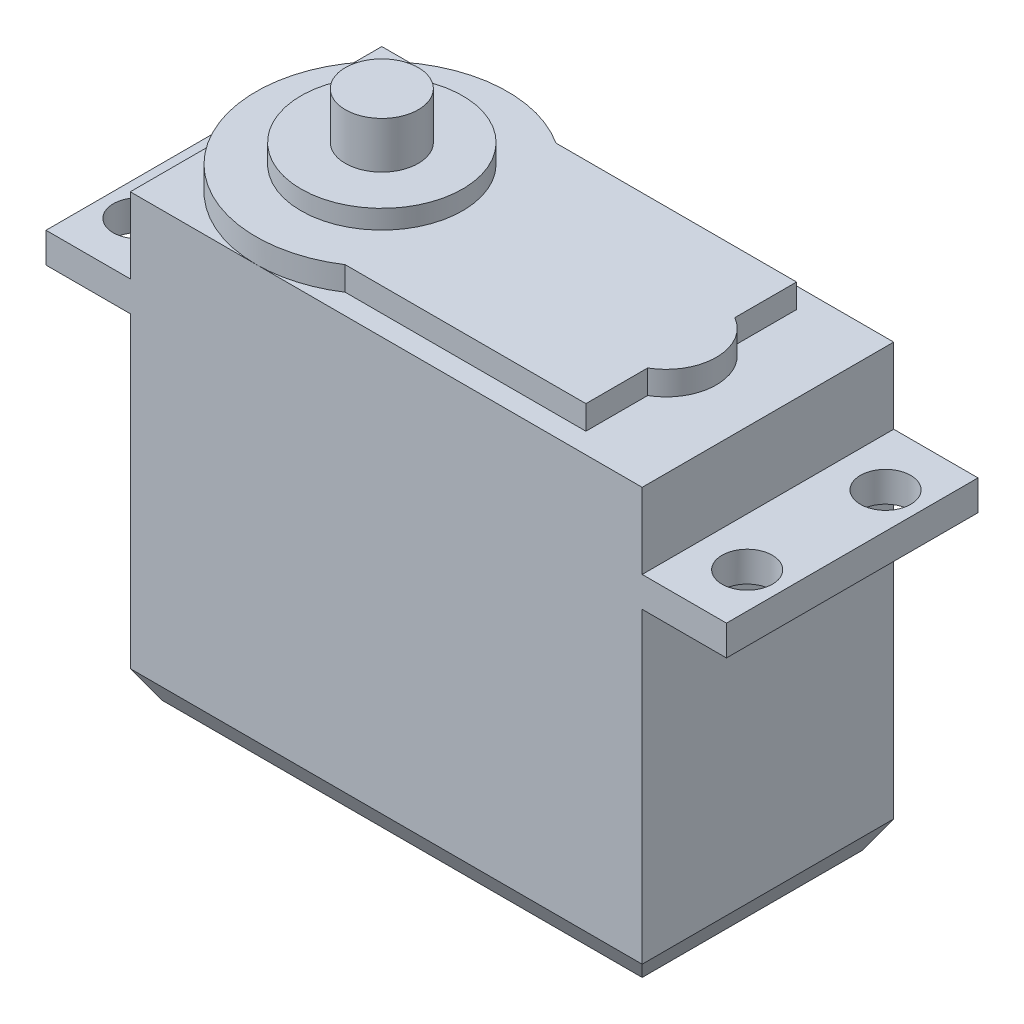
ISO-10303-21;
HEADER;
FILE_DESCRIPTION(('STEP AP214'),'2;1');
FILE_NAME('part.step','',(''),(''),'','','');
FILE_SCHEMA(('AUTOMOTIVE_DESIGN { 1 0 10303 214 1 1 1 1 }'));
ENDSEC;
DATA;
#1=APPLICATION_CONTEXT('core data for automotive mechanical design processes');
#2=APPLICATION_PROTOCOL_DEFINITION('international standard','automotive_design',2000,#1);
#3=PRODUCT_CONTEXT('',#1,'mechanical');
#4=PRODUCT('Part','Part','',(#3));
#5=PRODUCT_RELATED_PRODUCT_CATEGORY('part','',(#4));
#6=PRODUCT_DEFINITION_FORMATION('','',#4);
#7=PRODUCT_DEFINITION_CONTEXT('part definition',#1,'design');
#8=PRODUCT_DEFINITION('design','',#6,#7);
#9=PRODUCT_DEFINITION_SHAPE('','',#8);
#10=(LENGTH_UNIT() NAMED_UNIT(*) SI_UNIT(.MILLI.,.METRE.));
#11=(NAMED_UNIT(*) PLANE_ANGLE_UNIT() SI_UNIT($,.RADIAN.));
#12=(NAMED_UNIT(*) SI_UNIT($,.STERADIAN.) SOLID_ANGLE_UNIT());
#13=UNCERTAINTY_MEASURE_WITH_UNIT(LENGTH_MEASURE(1.E-05),#10,'distance_accuracy_value','');
#14=(GEOMETRIC_REPRESENTATION_CONTEXT(3) GLOBAL_UNCERTAINTY_ASSIGNED_CONTEXT((#13)) GLOBAL_UNIT_ASSIGNED_CONTEXT((#10,
#11,#12)) REPRESENTATION_CONTEXT('',''));
#15=CARTESIAN_POINT('',(0.,0.,0.));
#16=DIRECTION('',(0.,0.,1.));
#17=DIRECTION('',(1.,0.,0.));
#18=AXIS2_PLACEMENT_3D('',#15,#16,#17);
#19=CARTESIAN_POINT('',(-10.35,20.9,0.));
#20=DIRECTION('',(0.,1.,0.));
#21=DIRECTION('',(0.,0.,1.));
#22=AXIS2_PLACEMENT_3D('',#19,#20,#21);
#23=PLANE('',#22);
#24=CARTESIAN_POINT('',(-10.35,20.9,0.));
#25=DIRECTION('',(0.,1.,0.));
#26=DIRECTION('',(0.,0.,1.));
#27=AXIS2_PLACEMENT_3D('',#24,#25,#26);
#28=CIRCLE('',#27,6.425);
#29=CARTESIAN_POINT('',(-10.35,20.9,6.425));
#30=VERTEX_POINT('',#29);
#31=EDGE_CURVE('E335',#30,#30,#28,.T.);
#32=ORIENTED_EDGE('',*,*,#31,.T.);
#33=EDGE_LOOP('',(#32));
#34=FACE_BOUND('',#33,.T.);
#35=CARTESIAN_POINT('',(-10.35,20.9,0.));
#36=DIRECTION('',(0.,1.,0.));
#37=DIRECTION('',(0.,0.,1.));
#38=AXIS2_PLACEMENT_3D('',#35,#36,#37);
#39=CIRCLE('',#38,2.9);
#40=CARTESIAN_POINT('',(-10.35,20.9,2.9));
#41=VERTEX_POINT('',#40);
#42=EDGE_CURVE('E658',#41,#41,#39,.T.);
#43=ORIENTED_EDGE('',*,*,#42,.F.);
#44=EDGE_LOOP('',(#43));
#45=FACE_BOUND('',#44,.T.);
#46=ADVANCED_FACE('F33',(#34,#45),#23,.T.);
#47=CARTESIAN_POINT('',(-27.05,9.1,-10.));
#48=DIRECTION('',(0.,1.,0.));
#49=DIRECTION('',(0.,0.,1.));
#50=AXIS2_PLACEMENT_3D('',#47,#48,#49);
#51=PLANE('',#50);
#52=DIRECTION('',(0.,0.,1.));
#53=VECTOR('',#52,1.);
#54=CARTESIAN_POINT('',(-20.35,9.1,-10.));
#55=LINE('',#54,#53);
#56=CARTESIAN_POINT('',(-20.35,9.1,-10.));
#57=VERTEX_POINT('',#56);
#58=CARTESIAN_POINT('',(-20.35,9.1,10.));
#59=VERTEX_POINT('',#58);
#60=EDGE_CURVE('E241',#57,#59,#55,.T.);
#61=ORIENTED_EDGE('',*,*,#60,.T.);
#62=DIRECTION('',(1.,0.,0.));
#63=VECTOR('',#62,1.);
#64=CARTESIAN_POINT('',(-27.05,9.1,10.));
#65=LINE('',#64,#63);
#66=CARTESIAN_POINT('',(-27.05,9.1,10.));
#67=VERTEX_POINT('',#66);
#68=EDGE_CURVE('E294',#67,#59,#65,.T.);
#69=ORIENTED_EDGE('',*,*,#68,.F.);
#70=DIRECTION('',(0.,0.,1.));
#71=VECTOR('',#70,1.);
#72=CARTESIAN_POINT('',(-27.05,9.1,-10.));
#73=LINE('',#72,#71);
#74=CARTESIAN_POINT('',(-27.05,9.1,-10.));
#75=VERTEX_POINT('',#74);
#76=EDGE_CURVE('E427',#75,#67,#73,.T.);
#77=ORIENTED_EDGE('',*,*,#76,.F.);
#78=DIRECTION('',(1.,0.,0.));
#79=VECTOR('',#78,1.);
#80=CARTESIAN_POINT('',(-27.05,9.1,-10.));
#81=LINE('',#80,#79);
#82=EDGE_CURVE('E288',#75,#57,#81,.T.);
#83=ORIENTED_EDGE('',*,*,#82,.T.);
#84=EDGE_LOOP('',(#61,#69,#77,#83));
#85=FACE_BOUND('',#84,.T.);
#86=CARTESIAN_POINT('',(-24.2,9.1,5.5));
#87=DIRECTION('',(0.,1.,0.));
#88=DIRECTION('',(0.,0.,1.));
#89=AXIS2_PLACEMENT_3D('',#86,#87,#88);
#90=CIRCLE('',#89,2.);
#91=CARTESIAN_POINT('',(-24.2,9.1,7.5));
#92=VERTEX_POINT('',#91);
#93=EDGE_CURVE('E338',#92,#92,#90,.T.);
#94=ORIENTED_EDGE('',*,*,#93,.T.);
#95=EDGE_LOOP('',(#94));
#96=FACE_BOUND('',#95,.T.);
#97=CARTESIAN_POINT('',(-24.2,9.1,-5.5));
#98=DIRECTION('',(0.,1.,0.));
#99=DIRECTION('',(0.,0.,1.));
#100=AXIS2_PLACEMENT_3D('',#97,#98,#99);
#101=CIRCLE('',#100,2.);
#102=CARTESIAN_POINT('',(-24.2,9.1,-3.5));
#103=VERTEX_POINT('',#102);
#104=EDGE_CURVE('E661',#103,#103,#101,.F.);
#105=ORIENTED_EDGE('',*,*,#104,.F.);
#106=EDGE_LOOP('',(#105));
#107=FACE_BOUND('',#106,.T.);
#108=ADVANCED_FACE('F424',(#85,#96,#107),#51,.F.);
#109=CARTESIAN_POINT('',(-27.05,11.5,-10.));
#110=DIRECTION('',(0.,-1.,0.));
#111=DIRECTION('',(0.,0.,-1.));
#112=AXIS2_PLACEMENT_3D('',#109,#110,#111);
#113=PLANE('',#112);
#114=DIRECTION('',(0.,0.,-1.));
#115=VECTOR('',#114,1.);
#116=CARTESIAN_POINT('',(-20.35,11.5,-10.));
#117=LINE('',#116,#115);
#118=CARTESIAN_POINT('',(-20.35,11.5,10.));
#119=VERTEX_POINT('',#118);
#120=CARTESIAN_POINT('',(-20.35,11.5,-10.));
#121=VERTEX_POINT('',#120);
#122=EDGE_CURVE('E301',#119,#121,#117,.T.);
#123=ORIENTED_EDGE('',*,*,#122,.T.);
#124=DIRECTION('',(1.,0.,0.));
#125=VECTOR('',#124,1.);
#126=CARTESIAN_POINT('',(-27.05,11.5,-10.));
#127=LINE('',#126,#125);
#128=CARTESIAN_POINT('',(-27.05,11.5,-10.));
#129=VERTEX_POINT('',#128);
#130=EDGE_CURVE('E295',#129,#121,#127,.T.);
#131=ORIENTED_EDGE('',*,*,#130,.F.);
#132=DIRECTION('',(0.,0.,-1.));
#133=VECTOR('',#132,1.);
#134=CARTESIAN_POINT('',(-27.05,11.5,-10.));
#135=LINE('',#134,#133);
#136=CARTESIAN_POINT('',(-27.05,11.5,10.));
#137=VERTEX_POINT('',#136);
#138=EDGE_CURVE('E300',#137,#129,#135,.T.);
#139=ORIENTED_EDGE('',*,*,#138,.F.);
#140=DIRECTION('',(1.,0.,0.));
#141=VECTOR('',#140,1.);
#142=CARTESIAN_POINT('',(-27.05,11.5,10.));
#143=LINE('',#142,#141);
#144=EDGE_CURVE('E291',#137,#119,#143,.T.);
#145=ORIENTED_EDGE('',*,*,#144,.T.);
#146=EDGE_LOOP('',(#123,#131,#139,#145));
#147=FACE_BOUND('',#146,.T.);
#148=CARTESIAN_POINT('',(-24.2,11.5,5.5));
#149=DIRECTION('',(0.,1.,0.));
#150=DIRECTION('',(0.,0.,1.));
#151=AXIS2_PLACEMENT_3D('',#148,#149,#150);
#152=CIRCLE('',#151,2.);
#153=CARTESIAN_POINT('',(-24.2,11.5,7.5));
#154=VERTEX_POINT('',#153);
#155=EDGE_CURVE('E343',#154,#154,#152,.T.);
#156=ORIENTED_EDGE('',*,*,#155,.F.);
#157=EDGE_LOOP('',(#156));
#158=FACE_BOUND('',#157,.T.);
#159=CARTESIAN_POINT('',(-24.2,11.5,-5.5));
#160=DIRECTION('',(0.,-1.,0.));
#161=DIRECTION('',(0.,0.,-1.));
#162=AXIS2_PLACEMENT_3D('',#159,#160,#161);
#163=CIRCLE('',#162,2.);
#164=CARTESIAN_POINT('',(-24.2,11.5,-7.5));
#165=VERTEX_POINT('',#164);
#166=EDGE_CURVE('E657',#165,#165,#163,.T.);
#167=ORIENTED_EDGE('',*,*,#166,.T.);
#168=EDGE_LOOP('',(#167));
#169=FACE_BOUND('',#168,.T.);
#170=ADVANCED_FACE('F481',(#147,#158,#169),#113,.F.);
#171=CARTESIAN_POINT('',(27.05,11.5,-10.));
#172=DIRECTION('',(0.,1.,0.));
#173=DIRECTION('',(0.,0.,1.));
#174=AXIS2_PLACEMENT_3D('',#171,#172,#173);
#175=PLANE('',#174);
#176=DIRECTION('',(0.,0.,-1.));
#177=VECTOR('',#176,1.);
#178=CARTESIAN_POINT('',(20.35,11.5,-10.));
#179=LINE('',#178,#177);
#180=CARTESIAN_POINT('',(20.35,11.5,10.));
#181=VERTEX_POINT('',#180);
#182=CARTESIAN_POINT('',(20.35,11.5,-10.));
#183=VERTEX_POINT('',#182);
#184=EDGE_CURVE('E231',#181,#183,#179,.T.);
#185=ORIENTED_EDGE('',*,*,#184,.F.);
#186=DIRECTION('',(-1.,0.,0.));
#187=VECTOR('',#186,1.);
#188=CARTESIAN_POINT('',(27.05,11.5,10.));
#189=LINE('',#188,#187);
#190=CARTESIAN_POINT('',(27.05,11.5,10.));
#191=VERTEX_POINT('',#190);
#192=EDGE_CURVE('E242',#191,#181,#189,.T.);
#193=ORIENTED_EDGE('',*,*,#192,.F.);
#194=DIRECTION('',(0.,0.,-1.));
#195=VECTOR('',#194,1.);
#196=CARTESIAN_POINT('',(27.05,11.5,-10.));
#197=LINE('',#196,#195);
#198=CARTESIAN_POINT('',(27.05,11.5,-10.));
#199=VERTEX_POINT('',#198);
#200=EDGE_CURVE('E215',#191,#199,#197,.T.);
#201=ORIENTED_EDGE('',*,*,#200,.T.);
#202=DIRECTION('',(-1.,0.,0.));
#203=VECTOR('',#202,1.);
#204=CARTESIAN_POINT('',(27.05,11.5,-10.));
#205=LINE('',#204,#203);
#206=EDGE_CURVE('E239',#199,#183,#205,.T.);
#207=ORIENTED_EDGE('',*,*,#206,.T.);
#208=EDGE_LOOP('',(#185,#193,#201,#207));
#209=FACE_BOUND('',#208,.T.);
#210=CARTESIAN_POINT('',(24.2,11.5,5.5));
#211=DIRECTION('',(0.,1.,0.));
#212=DIRECTION('',(0.,0.,1.));
#213=AXIS2_PLACEMENT_3D('',#210,#211,#212);
#214=CIRCLE('',#213,2.);
#215=CARTESIAN_POINT('',(24.2,11.5,7.5));
#216=VERTEX_POINT('',#215);
#217=EDGE_CURVE('E331',#216,#216,#214,.T.);
#218=ORIENTED_EDGE('',*,*,#217,.F.);
#219=EDGE_LOOP('',(#218));
#220=FACE_BOUND('',#219,.T.);
#221=CARTESIAN_POINT('',(24.2,11.5,-5.5));
#222=DIRECTION('',(0.,-1.,0.));
#223=DIRECTION('',(0.,0.,-1.));
#224=AXIS2_PLACEMENT_3D('',#221,#222,#223);
#225=CIRCLE('',#224,2.);
#226=CARTESIAN_POINT('',(24.2,11.5,-7.5));
#227=VERTEX_POINT('',#226);
#228=EDGE_CURVE('E668',#227,#227,#225,.T.);
#229=ORIENTED_EDGE('',*,*,#228,.T.);
#230=EDGE_LOOP('',(#229));
#231=FACE_BOUND('',#230,.T.);
#232=ADVANCED_FACE('F513',(#209,#220,#231),#175,.T.);
#233=CARTESIAN_POINT('',(27.05,9.1,-10.));
#234=DIRECTION('',(0.,-1.,0.));
#235=DIRECTION('',(0.,0.,-1.));
#236=AXIS2_PLACEMENT_3D('',#233,#234,#235);
#237=PLANE('',#236);
#238=DIRECTION('',(0.,0.,1.));
#239=VECTOR('',#238,1.);
#240=CARTESIAN_POINT('',(20.35,9.1,-10.));
#241=LINE('',#240,#239);
#242=CARTESIAN_POINT('',(20.35,9.1,-10.));
#243=VERTEX_POINT('',#242);
#244=CARTESIAN_POINT('',(20.35,9.1,10.));
#245=VERTEX_POINT('',#244);
#246=EDGE_CURVE('E216',#243,#245,#241,.T.);
#247=ORIENTED_EDGE('',*,*,#246,.F.);
#248=DIRECTION('',(-1.,0.,0.));
#249=VECTOR('',#248,1.);
#250=CARTESIAN_POINT('',(27.05,9.1,-10.));
#251=LINE('',#250,#249);
#252=CARTESIAN_POINT('',(27.05,9.1,-10.));
#253=VERTEX_POINT('',#252);
#254=EDGE_CURVE('E225',#253,#243,#251,.T.);
#255=ORIENTED_EDGE('',*,*,#254,.F.);
#256=DIRECTION('',(0.,0.,1.));
#257=VECTOR('',#256,1.);
#258=CARTESIAN_POINT('',(27.05,9.1,-10.));
#259=LINE('',#258,#257);
#260=CARTESIAN_POINT('',(27.05,9.1,10.));
#261=VERTEX_POINT('',#260);
#262=EDGE_CURVE('E222',#253,#261,#259,.T.);
#263=ORIENTED_EDGE('',*,*,#262,.T.);
#264=DIRECTION('',(-1.,0.,0.));
#265=VECTOR('',#264,1.);
#266=CARTESIAN_POINT('',(27.05,9.1,10.));
#267=LINE('',#266,#265);
#268=EDGE_CURVE('E246',#261,#245,#267,.T.);
#269=ORIENTED_EDGE('',*,*,#268,.T.);
#270=EDGE_LOOP('',(#247,#255,#263,#269));
#271=FACE_BOUND('',#270,.T.);
#272=CARTESIAN_POINT('',(24.2,9.1,5.5));
#273=DIRECTION('',(0.,-1.,0.));
#274=DIRECTION('',(0.,0.,-1.));
#275=AXIS2_PLACEMENT_3D('',#272,#273,#274);
#276=CIRCLE('',#275,2.);
#277=CARTESIAN_POINT('',(24.2,9.1,3.5));
#278=VERTEX_POINT('',#277);
#279=EDGE_CURVE('E328',#278,#278,#276,.T.);
#280=ORIENTED_EDGE('',*,*,#279,.F.);
#281=EDGE_LOOP('',(#280));
#282=FACE_BOUND('',#281,.T.);
#283=CARTESIAN_POINT('',(24.2,9.1,-5.5));
#284=DIRECTION('',(0.,-1.,0.));
#285=DIRECTION('',(0.,0.,-1.));
#286=AXIS2_PLACEMENT_3D('',#283,#284,#285);
#287=CIRCLE('',#286,2.);
#288=CARTESIAN_POINT('',(24.2,9.1,-7.5));
#289=VERTEX_POINT('',#288);
#290=EDGE_CURVE('E37',#289,#289,#287,.F.);
#291=ORIENTED_EDGE('',*,*,#290,.T.);
#292=EDGE_LOOP('',(#291));
#293=FACE_BOUND('',#292,.T.);
#294=ADVANCED_FACE('F495',(#271,#282,#293),#237,.T.);
#295=CARTESIAN_POINT('',(12.25,19.4,0.));
#296=DIRECTION('',(0.,1.,0.));
#297=DIRECTION('',(0.,0.,1.));
#298=AXIS2_PLACEMENT_3D('',#295,#296,#297);
#299=PLANE('',#298);
#300=DIRECTION('',(-1.,0.,0.));
#301=VECTOR('',#300,1.);
#302=CARTESIAN_POINT('',(-4.88562675140141,19.4,-8.375));
#303=LINE('',#302,#301);
#304=CARTESIAN_POINT('',(14.25,19.4,-8.375));
#305=VERTEX_POINT('',#304);
#306=CARTESIAN_POINT('',(-4.88562675140141,19.4,-8.375));
#307=VERTEX_POINT('',#306);
#308=EDGE_CURVE('E192',#305,#307,#303,.T.);
#309=ORIENTED_EDGE('',*,*,#308,.T.);
#310=CARTESIAN_POINT('',(-10.35,19.4,0.));
#311=DIRECTION('',(0.,1.,0.));
#312=DIRECTION('',(0.,0.,1.));
#313=AXIS2_PLACEMENT_3D('',#310,#311,#312);
#314=CIRCLE('',#313,10.);
#315=CARTESIAN_POINT('',(-4.88562675140141,19.4,8.375));
#316=VERTEX_POINT('',#315);
#317=EDGE_CURVE('E180',#307,#316,#314,.T.);
#318=ORIENTED_EDGE('',*,*,#317,.T.);
#319=DIRECTION('',(1.,0.,0.));
#320=VECTOR('',#319,1.);
#321=CARTESIAN_POINT('',(-4.88562675140141,19.4,8.375));
#322=LINE('',#321,#320);
#323=CARTESIAN_POINT('',(14.25,19.4,8.375));
#324=VERTEX_POINT('',#323);
#325=EDGE_CURVE('E191',#316,#324,#322,.T.);
#326=ORIENTED_EDGE('',*,*,#325,.T.);
#327=DIRECTION('',(0.,0.,-1.));
#328=VECTOR('',#327,1.);
#329=CARTESIAN_POINT('',(14.25,19.4,8.375));
#330=LINE('',#329,#328);
#331=CARTESIAN_POINT('',(14.25,19.4,3.46410161513775));
#332=VERTEX_POINT('',#331);
#333=EDGE_CURVE('E350',#324,#332,#330,.T.);
#334=ORIENTED_EDGE('',*,*,#333,.T.);
#335=CARTESIAN_POINT('',(12.25,19.4,0.));
#336=DIRECTION('',(0.,1.,0.));
#337=DIRECTION('',(0.,0.,1.));
#338=AXIS2_PLACEMENT_3D('',#335,#336,#337);
#339=CIRCLE('',#338,4.);
#340=CARTESIAN_POINT('',(14.25,19.4,-3.46410161513775));
#341=VERTEX_POINT('',#340);
#342=EDGE_CURVE('E352',#332,#341,#339,.T.);
#343=ORIENTED_EDGE('',*,*,#342,.T.);
#344=DIRECTION('',(0.,0.,-1.));
#345=VECTOR('',#344,1.);
#346=CARTESIAN_POINT('',(14.25,19.4,-3.46410161513775));
#347=LINE('',#346,#345);
#348=EDGE_CURVE('E198',#341,#305,#347,.T.);
#349=ORIENTED_EDGE('',*,*,#348,.T.);
#350=EDGE_LOOP('',(#309,#318,#326,#334,#343,#349));
#351=FACE_BOUND('',#350,.T.);
#352=CARTESIAN_POINT('',(-10.35,19.4,0.));
#353=DIRECTION('',(0.,1.,0.));
#354=DIRECTION('',(0.,0.,1.));
#355=AXIS2_PLACEMENT_3D('',#352,#353,#354);
#356=CIRCLE('',#355,6.425);
#357=CARTESIAN_POINT('',(-10.35,19.4,6.425));
#358=VERTEX_POINT('',#357);
#359=EDGE_CURVE('E330',#358,#358,#356,.T.);
#360=ORIENTED_EDGE('',*,*,#359,.F.);
#361=EDGE_LOOP('',(#360));
#362=FACE_BOUND('',#361,.T.);
#363=ADVANCED_FACE('F195',(#351,#362),#299,.T.);
#364=CARTESIAN_POINT('',(-20.35,17.5,10.));
#365=DIRECTION('',(0.,-1.,0.));
#366=DIRECTION('',(0.,0.,-1.));
#367=AXIS2_PLACEMENT_3D('',#364,#365,#366);
#368=PLANE('',#367);
#369=DIRECTION('',(-1.,0.,0.));
#370=VECTOR('',#369,1.);
#371=CARTESIAN_POINT('',(-4.88562675140141,17.5,-8.375));
#372=LINE('',#371,#370);
#373=CARTESIAN_POINT('',(14.25,17.5,-8.375));
#374=VERTEX_POINT('',#373);
#375=CARTESIAN_POINT('',(-4.88562675140141,17.5,-8.375));
#376=VERTEX_POINT('',#375);
#377=EDGE_CURVE('E51',#374,#376,#372,.T.);
#378=ORIENTED_EDGE('',*,*,#377,.F.);
#379=DIRECTION('',(0.,0.,-1.));
#380=VECTOR('',#379,1.);
#381=CARTESIAN_POINT('',(14.25,17.5,-3.46410161513775));
#382=LINE('',#381,#380);
#383=CARTESIAN_POINT('',(14.25,17.5,-3.46410161513775));
#384=VERTEX_POINT('',#383);
#385=EDGE_CURVE('E55',#384,#374,#382,.T.);
#386=ORIENTED_EDGE('',*,*,#385,.F.);
#387=CARTESIAN_POINT('',(12.25,17.5,0.));
#388=DIRECTION('',(0.,1.,0.));
#389=DIRECTION('',(0.,0.,1.));
#390=AXIS2_PLACEMENT_3D('',#387,#388,#389);
#391=CIRCLE('',#390,4.);
#392=CARTESIAN_POINT('',(14.25,17.5,3.46410161513775));
#393=VERTEX_POINT('',#392);
#394=EDGE_CURVE('E363',#393,#384,#391,.T.);
#395=ORIENTED_EDGE('',*,*,#394,.F.);
#396=DIRECTION('',(0.,0.,-1.));
#397=VECTOR('',#396,1.);
#398=CARTESIAN_POINT('',(14.25,17.5,8.375));
#399=LINE('',#398,#397);
#400=CARTESIAN_POINT('',(14.25,17.5,8.375));
#401=VERTEX_POINT('',#400);
#402=EDGE_CURVE('E360',#401,#393,#399,.T.);
#403=ORIENTED_EDGE('',*,*,#402,.F.);
#404=DIRECTION('',(1.,0.,0.));
#405=VECTOR('',#404,1.);
#406=CARTESIAN_POINT('',(-4.88562675140141,17.5,8.375));
#407=LINE('',#406,#405);
#408=CARTESIAN_POINT('',(-4.88562675140141,17.5,8.375));
#409=VERTEX_POINT('',#408);
#410=EDGE_CURVE('E357',#409,#401,#407,.T.);
#411=ORIENTED_EDGE('',*,*,#410,.F.);
#412=CARTESIAN_POINT('',(-10.35,17.5,0.));
#413=DIRECTION('',(0.,1.,0.));
#414=DIRECTION('',(0.,0.,1.));
#415=AXIS2_PLACEMENT_3D('',#412,#413,#414);
#416=CIRCLE('',#415,10.);
#417=CARTESIAN_POINT('',(-10.35,17.5,10.));
#418=VERTEX_POINT('',#417);
#419=EDGE_CURVE('E321',#418,#409,#416,.T.);
#420=ORIENTED_EDGE('',*,*,#419,.F.);
#421=DIRECTION('',(-1.,0.,0.));
#422=VECTOR('',#421,1.);
#423=CARTESIAN_POINT('',(-20.35,17.5,10.));
#424=LINE('',#423,#422);
#425=CARTESIAN_POINT('',(20.35,17.5,10.));
#426=VERTEX_POINT('',#425);
#427=EDGE_CURVE('E313',#426,#418,#424,.T.);
#428=ORIENTED_EDGE('',*,*,#427,.F.);
#429=DIRECTION('',(0.,0.,-1.));
#430=VECTOR('',#429,1.);
#431=CARTESIAN_POINT('',(20.35,17.5,10.));
#432=LINE('',#431,#430);
#433=CARTESIAN_POINT('',(20.35,17.5,-10.));
#434=VERTEX_POINT('',#433);
#435=EDGE_CURVE('E262',#426,#434,#432,.T.);
#436=ORIENTED_EDGE('',*,*,#435,.T.);
#437=DIRECTION('',(-1.,0.,0.));
#438=VECTOR('',#437,1.);
#439=CARTESIAN_POINT('',(-20.35,17.5,-10.));
#440=LINE('',#439,#438);
#441=CARTESIAN_POINT('',(-10.35,17.5,-10.));
#442=VERTEX_POINT('',#441);
#443=EDGE_CURVE('E284',#434,#442,#440,.T.);
#444=ORIENTED_EDGE('',*,*,#443,.T.);
#445=EDGE_CURVE('E44',#376,#442,#416,.T.);
#446=ORIENTED_EDGE('',*,*,#445,.F.);
#447=EDGE_LOOP('',(#378,#386,#395,#403,#411,#420,#428,#436,#444,#446));
#448=FACE_BOUND('',#447,.T.);
#449=ADVANCED_FACE('F380',(#448),#368,.F.);
#450=CARTESIAN_POINT('',(-20.35,17.5,0.));
#451=VERTEX_POINT('',#450);
#452=EDGE_CURVE('E11',#442,#451,#416,.T.);
#453=ORIENTED_EDGE('',*,*,#452,.F.);
#454=CARTESIAN_POINT('',(-20.35,17.5,-10.));
#455=VERTEX_POINT('',#454);
#456=EDGE_CURVE('E276',#442,#455,#440,.T.);
#457=ORIENTED_EDGE('',*,*,#456,.T.);
#458=DIRECTION('',(0.,0.,-1.));
#459=VECTOR('',#458,1.);
#460=CARTESIAN_POINT('',(-20.35,17.5,10.));
#461=LINE('',#460,#459);
#462=EDGE_CURVE('E394',#451,#455,#461,.T.);
#463=ORIENTED_EDGE('',*,*,#462,.F.);
#464=EDGE_LOOP('',(#453,#457,#463));
#465=FACE_BOUND('',#464,.T.);
#466=ADVANCED_FACE('F395',(#465),#368,.F.);
#467=EDGE_CURVE('E42',#451,#418,#416,.T.);
#468=ORIENTED_EDGE('',*,*,#467,.F.);
#469=CARTESIAN_POINT('',(-20.35,17.5,10.));
#470=VERTEX_POINT('',#469);
#471=EDGE_CURVE('E389',#470,#451,#461,.T.);
#472=ORIENTED_EDGE('',*,*,#471,.F.);
#473=EDGE_CURVE('E317',#418,#470,#424,.T.);
#474=ORIENTED_EDGE('',*,*,#473,.F.);
#475=EDGE_LOOP('',(#468,#472,#474));
#476=FACE_BOUND('',#475,.T.);
#477=ADVANCED_FACE('F387',(#476),#368,.F.);
#478=CARTESIAN_POINT('',(20.35,-17.5,10.));
#479=DIRECTION('',(-1.,0.,0.));
#480=DIRECTION('',(0.,0.,1.));
#481=AXIS2_PLACEMENT_3D('',#478,#479,#480);
#482=PLANE('',#481);
#483=DIRECTION('',(0.,1.,0.));
#484=VECTOR('',#483,1.);
#485=CARTESIAN_POINT('',(20.35,-17.5,10.));
#486=LINE('',#485,#484);
#487=CARTESIAN_POINT('',(20.35,-15.3349364905389,10.));
#488=VERTEX_POINT('',#487);
#489=EDGE_CURVE('E315',#488,#245,#486,.T.);
#490=ORIENTED_EDGE('',*,*,#489,.F.);
#491=DIRECTION('',(0.,0.,-1.));
#492=VECTOR('',#491,1.);
#493=CARTESIAN_POINT('',(20.35,-15.3349364905389,10.));
#494=LINE('',#493,#492);
#495=CARTESIAN_POINT('',(20.35,-15.3349364905389,-10.));
#496=VERTEX_POINT('',#495);
#497=EDGE_CURVE('E318',#488,#496,#494,.T.);
#498=ORIENTED_EDGE('',*,*,#497,.T.);
#499=DIRECTION('',(0.,1.,0.));
#500=VECTOR('',#499,1.);
#501=CARTESIAN_POINT('',(20.35,-17.5,-10.));
#502=LINE('',#501,#500);
#503=EDGE_CURVE('E273',#496,#243,#502,.T.);
#504=ORIENTED_EDGE('',*,*,#503,.T.);
#505=ORIENTED_EDGE('',*,*,#246,.T.);
#506=EDGE_LOOP('',(#490,#498,#504,#505));
#507=FACE_BOUND('',#506,.T.);
#508=ADVANCED_FACE('F460',(#507),#482,.F.);
#509=CARTESIAN_POINT('',(-20.35,-17.5,10.));
#510=DIRECTION('',(1.,0.,0.));
#511=DIRECTION('',(0.,0.,-1.));
#512=AXIS2_PLACEMENT_3D('',#509,#510,#511);
#513=PLANE('',#512);
#514=ORIENTED_EDGE('',*,*,#122,.F.);
#515=DIRECTION('',(0.,-1.,0.));
#516=VECTOR('',#515,1.);
#517=CARTESIAN_POINT('',(-20.35,-17.5,10.));
#518=LINE('',#517,#516);
#519=EDGE_CURVE('E399',#470,#119,#518,.T.);
#520=ORIENTED_EDGE('',*,*,#519,.F.);
#521=ORIENTED_EDGE('',*,*,#471,.T.);
#522=ORIENTED_EDGE('',*,*,#462,.T.);
#523=DIRECTION('',(0.,-1.,0.));
#524=VECTOR('',#523,1.);
#525=CARTESIAN_POINT('',(-20.35,-17.5,-10.));
#526=LINE('',#525,#524);
#527=EDGE_CURVE('E407',#455,#121,#526,.T.);
#528=ORIENTED_EDGE('',*,*,#527,.T.);
#529=EDGE_LOOP('',(#514,#520,#521,#522,#528));
#530=FACE_BOUND('',#529,.T.);
#531=ADVANCED_FACE('F401',(#530),#513,.F.);
#532=CARTESIAN_POINT('',(-20.35,-15.3349364905389,-10.));
#533=VERTEX_POINT('',#532);
#534=EDGE_CURVE('E409',#57,#533,#526,.T.);
#535=ORIENTED_EDGE('',*,*,#534,.T.);
#536=DIRECTION('',(0.,0.,1.));
#537=VECTOR('',#536,1.);
#538=CARTESIAN_POINT('',(-20.35,-15.3349364905389,10.));
#539=LINE('',#538,#537);
#540=CARTESIAN_POINT('',(-20.35,-15.3349364905389,10.));
#541=VERTEX_POINT('',#540);
#542=EDGE_CURVE('E269',#533,#541,#539,.T.);
#543=ORIENTED_EDGE('',*,*,#542,.T.);
#544=EDGE_CURVE('E413',#59,#541,#518,.T.);
#545=ORIENTED_EDGE('',*,*,#544,.F.);
#546=ORIENTED_EDGE('',*,*,#60,.F.);
#547=EDGE_LOOP('',(#535,#543,#545,#546));
#548=FACE_BOUND('',#547,.T.);
#549=ADVANCED_FACE('F437',(#548),#513,.F.);
#550=EDGE_CURVE('E236',#181,#426,#486,.T.);
#551=ORIENTED_EDGE('',*,*,#550,.F.);
#552=ORIENTED_EDGE('',*,*,#184,.T.);
#553=EDGE_CURVE('E277',#183,#434,#502,.T.);
#554=ORIENTED_EDGE('',*,*,#553,.T.);
#555=ORIENTED_EDGE('',*,*,#435,.F.);
#556=EDGE_LOOP('',(#551,#552,#554,#555));
#557=FACE_BOUND('',#556,.T.);
#558=ADVANCED_FACE('F530',(#557),#482,.F.);
#559=CARTESIAN_POINT('',(-20.35,-17.5,10.));
#560=DIRECTION('',(0.,1.,0.));
#561=DIRECTION('',(0.,0.,1.));
#562=AXIS2_PLACEMENT_3D('',#559,#560,#561);
#563=PLANE('',#562);
#564=DIRECTION('',(-1.,0.,0.));
#565=VECTOR('',#564,1.);
#566=CARTESIAN_POINT('',(-20.35,-17.5,8.75));
#567=LINE('',#566,#565);
#568=CARTESIAN_POINT('',(19.1,-17.5,8.75));
#569=VERTEX_POINT('',#568);
#570=CARTESIAN_POINT('',(-19.1,-17.5,8.75));
#571=VERTEX_POINT('',#570);
#572=EDGE_CURVE('E259',#569,#571,#567,.T.);
#573=ORIENTED_EDGE('',*,*,#572,.T.);
#574=DIRECTION('',(0.,0.,-1.));
#575=VECTOR('',#574,1.);
#576=CARTESIAN_POINT('',(-19.1,-17.5,10.));
#577=LINE('',#576,#575);
#578=CARTESIAN_POINT('',(-19.1,-17.5,-8.75));
#579=VERTEX_POINT('',#578);
#580=EDGE_CURVE('E266',#571,#579,#577,.T.);
#581=ORIENTED_EDGE('',*,*,#580,.T.);
#582=DIRECTION('',(1.,0.,0.));
#583=VECTOR('',#582,1.);
#584=CARTESIAN_POINT('',(20.35,-17.5,-8.75));
#585=LINE('',#584,#583);
#586=CARTESIAN_POINT('',(19.1,-17.5,-8.75));
#587=VERTEX_POINT('',#586);
#588=EDGE_CURVE('E264',#579,#587,#585,.T.);
#589=ORIENTED_EDGE('',*,*,#588,.T.);
#590=DIRECTION('',(0.,0.,1.));
#591=VECTOR('',#590,1.);
#592=CARTESIAN_POINT('',(19.1,-17.5,10.));
#593=LINE('',#592,#591);
#594=EDGE_CURVE('E261',#587,#569,#593,.T.);
#595=ORIENTED_EDGE('',*,*,#594,.T.);
#596=EDGE_LOOP('',(#573,#581,#589,#595));
#597=FACE_BOUND('',#596,.T.);
#598=ADVANCED_FACE('F450',(#597),#563,.F.);
#599=CARTESIAN_POINT('',(20.35,17.5,10.));
#600=DIRECTION('',(0.,0.,-1.));
#601=DIRECTION('',(-1.,0.,0.));
#602=AXIS2_PLACEMENT_3D('',#599,#600,#601);
#603=PLANE('',#602);
#604=ORIENTED_EDGE('',*,*,#544,.T.);
#605=DIRECTION('',(1.,0.,0.));
#606=VECTOR('',#605,1.);
#607=CARTESIAN_POINT('',(20.35,-15.3349364905389,10.));
#608=LINE('',#607,#606);
#609=EDGE_CURVE('E320',#541,#488,#608,.T.);
#610=ORIENTED_EDGE('',*,*,#609,.T.);
#611=ORIENTED_EDGE('',*,*,#489,.T.);
#612=ORIENTED_EDGE('',*,*,#268,.F.);
#613=DIRECTION('',(0.,1.,0.));
#614=VECTOR('',#613,1.);
#615=CARTESIAN_POINT('',(27.05,11.5,10.));
#616=LINE('',#615,#614);
#617=EDGE_CURVE('E219',#261,#191,#616,.T.);
#618=ORIENTED_EDGE('',*,*,#617,.T.);
#619=ORIENTED_EDGE('',*,*,#192,.T.);
#620=ORIENTED_EDGE('',*,*,#550,.T.);
#621=ORIENTED_EDGE('',*,*,#427,.T.);
#622=ORIENTED_EDGE('',*,*,#473,.T.);
#623=ORIENTED_EDGE('',*,*,#519,.T.);
#624=ORIENTED_EDGE('',*,*,#144,.F.);
#625=DIRECTION('',(0.,1.,0.));
#626=VECTOR('',#625,1.);
#627=CARTESIAN_POINT('',(-27.05,11.5,10.));
#628=LINE('',#627,#626);
#629=EDGE_CURVE('E823',#67,#137,#628,.T.);
#630=ORIENTED_EDGE('',*,*,#629,.F.);
#631=ORIENTED_EDGE('',*,*,#68,.T.);
#632=EDGE_LOOP('',(#604,#610,#611,#612,#618,#619,#620,#621,#622,#623,#624,#630,#631));
#633=FACE_BOUND('',#632,.T.);
#634=ADVANCED_FACE('F457',(#633),#603,.F.);
#635=CARTESIAN_POINT('',(20.35,17.5,-10.));
#636=DIRECTION('',(0.,0.,-1.));
#637=DIRECTION('',(-1.,0.,0.));
#638=AXIS2_PLACEMENT_3D('',#635,#636,#637);
#639=PLANE('',#638);
#640=ORIENTED_EDGE('',*,*,#503,.F.);
#641=DIRECTION('',(-1.,0.,0.));
#642=VECTOR('',#641,1.);
#643=CARTESIAN_POINT('',(-20.35,-15.3349364905389,-10.));
#644=LINE('',#643,#642);
#645=EDGE_CURVE('E272',#496,#533,#644,.T.);
#646=ORIENTED_EDGE('',*,*,#645,.T.);
#647=ORIENTED_EDGE('',*,*,#534,.F.);
#648=ORIENTED_EDGE('',*,*,#82,.F.);
#649=DIRECTION('',(0.,-1.,0.));
#650=VECTOR('',#649,1.);
#651=CARTESIAN_POINT('',(-27.05,11.5,-10.));
#652=LINE('',#651,#650);
#653=EDGE_CURVE('E305',#129,#75,#652,.T.);
#654=ORIENTED_EDGE('',*,*,#653,.F.);
#655=ORIENTED_EDGE('',*,*,#130,.T.);
#656=ORIENTED_EDGE('',*,*,#527,.F.);
#657=ORIENTED_EDGE('',*,*,#456,.F.);
#658=ORIENTED_EDGE('',*,*,#443,.F.);
#659=ORIENTED_EDGE('',*,*,#553,.F.);
#660=ORIENTED_EDGE('',*,*,#206,.F.);
#661=DIRECTION('',(0.,-1.,0.));
#662=VECTOR('',#661,1.);
#663=CARTESIAN_POINT('',(27.05,11.5,-10.));
#664=LINE('',#663,#662);
#665=EDGE_CURVE('E212',#199,#253,#664,.T.);
#666=ORIENTED_EDGE('',*,*,#665,.T.);
#667=ORIENTED_EDGE('',*,*,#254,.T.);
#668=EDGE_LOOP('',(#640,#646,#647,#648,#654,#655,#656,#657,#658,#659,#660,#666,#667));
#669=FACE_BOUND('',#668,.T.);
#670=ADVANCED_FACE('F433',(#669),#639,.T.);
#671=CARTESIAN_POINT('',(-27.05,9.1,-10.));
#672=DIRECTION('',(-1.,0.,0.));
#673=DIRECTION('',(0.,0.,1.));
#674=AXIS2_PLACEMENT_3D('',#671,#672,#673);
#675=PLANE('',#674);
#676=ORIENTED_EDGE('',*,*,#653,.T.);
#677=ORIENTED_EDGE('',*,*,#76,.T.);
#678=ORIENTED_EDGE('',*,*,#629,.T.);
#679=ORIENTED_EDGE('',*,*,#138,.T.);
#680=EDGE_LOOP('',(#676,#677,#678,#679));
#681=FACE_BOUND('',#680,.T.);
#682=ADVANCED_FACE('F470',(#681),#675,.T.);
#683=CARTESIAN_POINT('',(27.05,9.1,-10.));
#684=DIRECTION('',(1.,0.,0.));
#685=DIRECTION('',(0.,0.,1.));
#686=AXIS2_PLACEMENT_3D('',#683,#684,#685);
#687=PLANE('',#686);
#688=ORIENTED_EDGE('',*,*,#665,.F.);
#689=ORIENTED_EDGE('',*,*,#200,.F.);
#690=ORIENTED_EDGE('',*,*,#617,.F.);
#691=ORIENTED_EDGE('',*,*,#262,.F.);
#692=EDGE_LOOP('',(#688,#689,#690,#691));
#693=FACE_BOUND('',#692,.T.);
#694=ADVANCED_FACE('F464',(#693),#687,.T.);
#695=CARTESIAN_POINT('',(20.35,-15.3349364905389,10.));
#696=DIRECTION('',(-0.866025403784438,0.500000000000001,0.));
#697=DIRECTION('',(-0.500000000000001,-0.866025403784438,0.));
#698=AXIS2_PLACEMENT_3D('',#695,#696,#697);
#699=PLANE('',#698);
#700=DIRECTION('',(-0.447213595499959,-0.774596669241483,0.447213595499959));
#701=VECTOR('',#700,1.);
#702=CARTESIAN_POINT('',(16.35,-22.2631397208144,-5.99999999999999));
#703=LINE('',#702,#701);
#704=EDGE_CURVE('E324',#496,#587,#703,.T.);
#705=ORIENTED_EDGE('',*,*,#704,.F.);
#706=ORIENTED_EDGE('',*,*,#497,.F.);
#707=DIRECTION('',(0.447213595499959,0.774596669241483,0.447213595499959));
#708=VECTOR('',#707,1.);
#709=CARTESIAN_POINT('',(20.35,-15.3349364905389,10.));
#710=LINE('',#709,#708);
#711=EDGE_CURVE('E235',#569,#488,#710,.T.);
#712=ORIENTED_EDGE('',*,*,#711,.F.);
#713=ORIENTED_EDGE('',*,*,#594,.F.);
#714=EDGE_LOOP('',(#705,#706,#712,#713));
#715=FACE_BOUND('',#714,.T.);
#716=ADVANCED_FACE('F35',(#715),#699,.F.);
#717=CARTESIAN_POINT('',(20.35,-15.3349364905389,10.));
#718=DIRECTION('',(0.,0.500000000000001,-0.866025403784438));
#719=DIRECTION('',(0.,0.866025403784438,0.500000000000001));
#720=AXIS2_PLACEMENT_3D('',#717,#718,#719);
#721=PLANE('',#720);
#722=ORIENTED_EDGE('',*,*,#711,.T.);
#723=ORIENTED_EDGE('',*,*,#609,.F.);
#724=DIRECTION('',(0.447213595499959,-0.774596669241483,-0.447213595499959));
#725=VECTOR('',#724,1.);
#726=CARTESIAN_POINT('',(-12.21,-29.4338300641496,1.85999999999998));
#727=LINE('',#726,#725);
#728=EDGE_CURVE('E206',#571,#541,#727,.F.);
#729=ORIENTED_EDGE('',*,*,#728,.F.);
#730=ORIENTED_EDGE('',*,*,#572,.F.);
#731=EDGE_LOOP('',(#722,#723,#729,#730));
#732=FACE_BOUND('',#731,.T.);
#733=ADVANCED_FACE('F454',(#732),#721,.F.);
#734=CARTESIAN_POINT('',(-20.35,-17.5,-8.75));
#735=DIRECTION('',(0.,-0.500000000000001,-0.866025403784438));
#736=DIRECTION('',(0.,0.866025403784438,-0.500000000000001));
#737=AXIS2_PLACEMENT_3D('',#734,#735,#736);
#738=PLANE('',#737);
#739=ORIENTED_EDGE('',*,*,#704,.T.);
#740=ORIENTED_EDGE('',*,*,#588,.F.);
#741=DIRECTION('',(0.447213595499959,-0.774596669241483,0.447213595499959));
#742=VECTOR('',#741,1.);
#743=CARTESIAN_POINT('',(-19.35,-17.0669872981078,-9.));
#744=LINE('',#743,#742);
#745=EDGE_CURVE('E204',#533,#579,#744,.T.);
#746=ORIENTED_EDGE('',*,*,#745,.F.);
#747=ORIENTED_EDGE('',*,*,#645,.F.);
#748=EDGE_LOOP('',(#739,#740,#746,#747));
#749=FACE_BOUND('',#748,.T.);
#750=ADVANCED_FACE('F446',(#749),#738,.T.);
#751=CARTESIAN_POINT('',(-19.1,-17.5,10.));
#752=DIRECTION('',(0.866025403784438,0.500000000000001,0.));
#753=DIRECTION('',(-0.500000000000001,0.866025403784438,0.));
#754=AXIS2_PLACEMENT_3D('',#751,#752,#753);
#755=PLANE('',#754);
#756=ORIENTED_EDGE('',*,*,#728,.T.);
#757=ORIENTED_EDGE('',*,*,#542,.F.);
#758=ORIENTED_EDGE('',*,*,#745,.T.);
#759=ORIENTED_EDGE('',*,*,#580,.F.);
#760=EDGE_LOOP('',(#756,#757,#758,#759));
#761=FACE_BOUND('',#760,.T.);
#762=ADVANCED_FACE('F440',(#761),#755,.F.);
#763=CARTESIAN_POINT('',(-4.88562675140141,19.4,-8.375));
#764=DIRECTION('',(0.,0.,1.));
#765=DIRECTION('',(1.,0.,0.));
#766=AXIS2_PLACEMENT_3D('',#763,#764,#765);
#767=PLANE('',#766);
#768=ORIENTED_EDGE('',*,*,#377,.T.);
#769=DIRECTION('',(0.,-1.,0.));
#770=VECTOR('',#769,1.);
#771=CARTESIAN_POINT('',(-4.88562675140141,19.4,-8.375));
#772=LINE('',#771,#770);
#773=EDGE_CURVE('E185',#307,#376,#772,.T.);
#774=ORIENTED_EDGE('',*,*,#773,.F.);
#775=ORIENTED_EDGE('',*,*,#308,.F.);
#776=DIRECTION('',(0.,-1.,0.));
#777=VECTOR('',#776,1.);
#778=CARTESIAN_POINT('',(14.25,19.4,-8.375));
#779=LINE('',#778,#777);
#780=EDGE_CURVE('E355',#305,#374,#779,.T.);
#781=ORIENTED_EDGE('',*,*,#780,.T.);
#782=EDGE_LOOP('',(#768,#774,#775,#781));
#783=FACE_BOUND('',#782,.T.);
#784=ADVANCED_FACE('F203',(#783),#767,.F.);
#785=CARTESIAN_POINT('',(-10.35,19.4,0.));
#786=DIRECTION('',(0.,-1.,0.));
#787=DIRECTION('',(0.,0.,-1.));
#788=AXIS2_PLACEMENT_3D('',#785,#786,#787);
#789=CYLINDRICAL_SURFACE('',#788,10.);
#790=ORIENTED_EDGE('',*,*,#445,.T.);
#791=ORIENTED_EDGE('',*,*,#452,.T.);
#792=ORIENTED_EDGE('',*,*,#467,.T.);
#793=ORIENTED_EDGE('',*,*,#419,.T.);
#794=DIRECTION('',(0.,-1.,0.));
#795=VECTOR('',#794,1.);
#796=CARTESIAN_POINT('',(-4.88562675140141,19.4,8.375));
#797=LINE('',#796,#795);
#798=EDGE_CURVE('E188',#316,#409,#797,.T.);
#799=ORIENTED_EDGE('',*,*,#798,.F.);
#800=ORIENTED_EDGE('',*,*,#317,.F.);
#801=ORIENTED_EDGE('',*,*,#773,.T.);
#802=EDGE_LOOP('',(#790,#791,#792,#793,#799,#800,#801));
#803=FACE_BOUND('',#802,.T.);
#804=ADVANCED_FACE('F183',(#803),#789,.T.);
#805=CARTESIAN_POINT('',(-4.88562675140141,19.4,8.375));
#806=DIRECTION('',(0.,0.,-1.));
#807=DIRECTION('',(-1.,0.,0.));
#808=AXIS2_PLACEMENT_3D('',#805,#806,#807);
#809=PLANE('',#808);
#810=ORIENTED_EDGE('',*,*,#410,.T.);
#811=DIRECTION('',(0.,-1.,0.));
#812=VECTOR('',#811,1.);
#813=CARTESIAN_POINT('',(14.25,19.4,8.375));
#814=LINE('',#813,#812);
#815=EDGE_CURVE('E208',#324,#401,#814,.T.);
#816=ORIENTED_EDGE('',*,*,#815,.F.);
#817=ORIENTED_EDGE('',*,*,#325,.F.);
#818=ORIENTED_EDGE('',*,*,#798,.T.);
#819=EDGE_LOOP('',(#810,#816,#817,#818));
#820=FACE_BOUND('',#819,.T.);
#821=ADVANCED_FACE('F379',(#820),#809,.F.);
#822=CARTESIAN_POINT('',(14.25,19.4,8.375));
#823=DIRECTION('',(-1.,0.,0.));
#824=DIRECTION('',(0.,0.,1.));
#825=AXIS2_PLACEMENT_3D('',#822,#823,#824);
#826=PLANE('',#825);
#827=ORIENTED_EDGE('',*,*,#402,.T.);
#828=DIRECTION('',(0.,-1.,0.));
#829=VECTOR('',#828,1.);
#830=CARTESIAN_POINT('',(14.25,19.4,3.46410161513775));
#831=LINE('',#830,#829);
#832=EDGE_CURVE('E370',#332,#393,#831,.T.);
#833=ORIENTED_EDGE('',*,*,#832,.F.);
#834=ORIENTED_EDGE('',*,*,#333,.F.);
#835=ORIENTED_EDGE('',*,*,#815,.T.);
#836=EDGE_LOOP('',(#827,#833,#834,#835));
#837=FACE_BOUND('',#836,.T.);
#838=ADVANCED_FACE('F376',(#837),#826,.F.);
#839=CARTESIAN_POINT('',(12.25,19.4,0.));
#840=DIRECTION('',(0.,-1.,0.));
#841=DIRECTION('',(0.,0.,-1.));
#842=AXIS2_PLACEMENT_3D('',#839,#840,#841);
#843=CYLINDRICAL_SURFACE('',#842,4.);
#844=ORIENTED_EDGE('',*,*,#394,.T.);
#845=DIRECTION('',(0.,-1.,0.));
#846=VECTOR('',#845,1.);
#847=CARTESIAN_POINT('',(14.25,19.4,-3.46410161513775));
#848=LINE('',#847,#846);
#849=EDGE_CURVE('E367',#341,#384,#848,.T.);
#850=ORIENTED_EDGE('',*,*,#849,.F.);
#851=ORIENTED_EDGE('',*,*,#342,.F.);
#852=ORIENTED_EDGE('',*,*,#832,.T.);
#853=EDGE_LOOP('',(#844,#850,#851,#852));
#854=FACE_BOUND('',#853,.T.);
#855=ADVANCED_FACE('F498',(#854),#843,.T.);
#856=CARTESIAN_POINT('',(14.25,19.4,-3.46410161513775));
#857=DIRECTION('',(-1.,0.,0.));
#858=DIRECTION('',(0.,0.,1.));
#859=AXIS2_PLACEMENT_3D('',#856,#857,#858);
#860=PLANE('',#859);
#861=ORIENTED_EDGE('',*,*,#385,.T.);
#862=ORIENTED_EDGE('',*,*,#780,.F.);
#863=ORIENTED_EDGE('',*,*,#348,.F.);
#864=ORIENTED_EDGE('',*,*,#849,.T.);
#865=EDGE_LOOP('',(#861,#862,#863,#864));
#866=FACE_BOUND('',#865,.T.);
#867=ADVANCED_FACE('F491',(#866),#860,.F.);
#868=CARTESIAN_POINT('',(-10.35,20.9,0.));
#869=DIRECTION('',(0.,-1.,0.));
#870=DIRECTION('',(0.,0.,-1.));
#871=AXIS2_PLACEMENT_3D('',#868,#869,#870);
#872=CYLINDRICAL_SURFACE('',#871,6.425);
#873=ORIENTED_EDGE('',*,*,#31,.F.);
#874=EDGE_LOOP('',(#873));
#875=FACE_BOUND('',#874,.T.);
#876=ORIENTED_EDGE('',*,*,#359,.T.);
#877=EDGE_LOOP('',(#876));
#878=FACE_BOUND('',#877,.T.);
#879=ADVANCED_FACE('F488',(#875,#878),#872,.T.);
#880=CARTESIAN_POINT('',(24.2,1.5,5.5));
#881=DIRECTION('',(0.,1.,0.));
#882=DIRECTION('',(0.,0.,1.));
#883=AXIS2_PLACEMENT_3D('',#880,#881,#882);
#884=CYLINDRICAL_SURFACE('',#883,2.);
#885=ORIENTED_EDGE('',*,*,#279,.T.);
#886=EDGE_LOOP('',(#885));
#887=FACE_BOUND('',#886,.T.);
#888=ORIENTED_EDGE('',*,*,#217,.T.);
#889=EDGE_LOOP('',(#888));
#890=FACE_BOUND('',#889,.T.);
#891=ADVANCED_FACE('F486',(#887,#890),#884,.F.);
#892=CARTESIAN_POINT('',(-24.2,1.5,5.5));
#893=DIRECTION('',(0.,1.,0.));
#894=DIRECTION('',(0.,0.,1.));
#895=AXIS2_PLACEMENT_3D('',#892,#893,#894);
#896=CYLINDRICAL_SURFACE('',#895,2.);
#897=ORIENTED_EDGE('',*,*,#155,.T.);
#898=EDGE_LOOP('',(#897));
#899=FACE_BOUND('',#898,.T.);
#900=ORIENTED_EDGE('',*,*,#93,.F.);
#901=EDGE_LOOP('',(#900));
#902=FACE_BOUND('',#901,.T.);
#903=ADVANCED_FACE('F610',(#899,#902),#896,.F.);
#904=CARTESIAN_POINT('',(24.2,1.5,-5.5));
#905=DIRECTION('',(0.,1.,0.));
#906=DIRECTION('',(0.,0.,1.));
#907=AXIS2_PLACEMENT_3D('',#904,#905,#906);
#908=CYLINDRICAL_SURFACE('',#907,2.);
#909=ORIENTED_EDGE('',*,*,#290,.F.);
#910=EDGE_LOOP('',(#909));
#911=FACE_BOUND('',#910,.T.);
#912=ORIENTED_EDGE('',*,*,#228,.F.);
#913=EDGE_LOOP('',(#912));
#914=FACE_BOUND('',#913,.T.);
#915=ADVANCED_FACE('F616',(#911,#914),#908,.F.);
#916=CARTESIAN_POINT('',(-24.2,1.5,-5.5));
#917=DIRECTION('',(0.,1.,0.));
#918=DIRECTION('',(0.,0.,1.));
#919=AXIS2_PLACEMENT_3D('',#916,#917,#918);
#920=CYLINDRICAL_SURFACE('',#919,2.);
#921=ORIENTED_EDGE('',*,*,#166,.F.);
#922=EDGE_LOOP('',(#921));
#923=FACE_BOUND('',#922,.T.);
#924=ORIENTED_EDGE('',*,*,#104,.T.);
#925=EDGE_LOOP('',(#924));
#926=FACE_BOUND('',#925,.T.);
#927=ADVANCED_FACE('F622',(#923,#926),#920,.F.);
#928=CARTESIAN_POINT('',(-10.35,24.6,0.));
#929=DIRECTION('',(0.,-1.,0.));
#930=DIRECTION('',(0.,0.,-1.));
#931=AXIS2_PLACEMENT_3D('',#928,#929,#930);
#932=CYLINDRICAL_SURFACE('',#931,2.9);
#933=CARTESIAN_POINT('',(-10.35,24.6,0.));
#934=DIRECTION('',(0.,1.,0.));
#935=DIRECTION('',(0.,0.,1.));
#936=AXIS2_PLACEMENT_3D('',#933,#934,#935);
#937=CIRCLE('',#936,2.9);
#938=CARTESIAN_POINT('',(-10.35,24.6,2.9));
#939=VERTEX_POINT('',#938);
#940=EDGE_CURVE('E656',#939,#939,#937,.T.);
#941=ORIENTED_EDGE('',*,*,#940,.F.);
#942=EDGE_LOOP('',(#941));
#943=FACE_BOUND('',#942,.T.);
#944=ORIENTED_EDGE('',*,*,#42,.T.);
#945=EDGE_LOOP('',(#944));
#946=FACE_BOUND('',#945,.T.);
#947=ADVANCED_FACE('F628',(#943,#946),#932,.T.);
#948=CARTESIAN_POINT('',(-10.35,24.6,0.));
#949=DIRECTION('',(0.,1.,0.));
#950=DIRECTION('',(0.,0.,1.));
#951=AXIS2_PLACEMENT_3D('',#948,#949,#950);
#952=PLANE('',#951);
#953=ORIENTED_EDGE('',*,*,#940,.T.);
#954=EDGE_LOOP('',(#953));
#955=FACE_BOUND('',#954,.T.);
#956=ADVANCED_FACE('F640',(#955),#952,.T.);
#957=CLOSED_SHELL('',(#46,#108,#170,#232,#294,#363,#449,#466,#477,#508,#531,#549,#558,#598,#634,
#670,#682,#694,#716,#733,#750,#762,#784,#804,#821,#838,#855,#867,#879,#891,#903,#915,#927,#947,#956));
#958=MANIFOLD_SOLID_BREP('B2',#957);
#959=ADVANCED_BREP_SHAPE_REPRESENTATION('',(#18,#958),#14);
#960=SHAPE_DEFINITION_REPRESENTATION(#9,#959);
ENDSEC;
END-ISO-10303-21;
